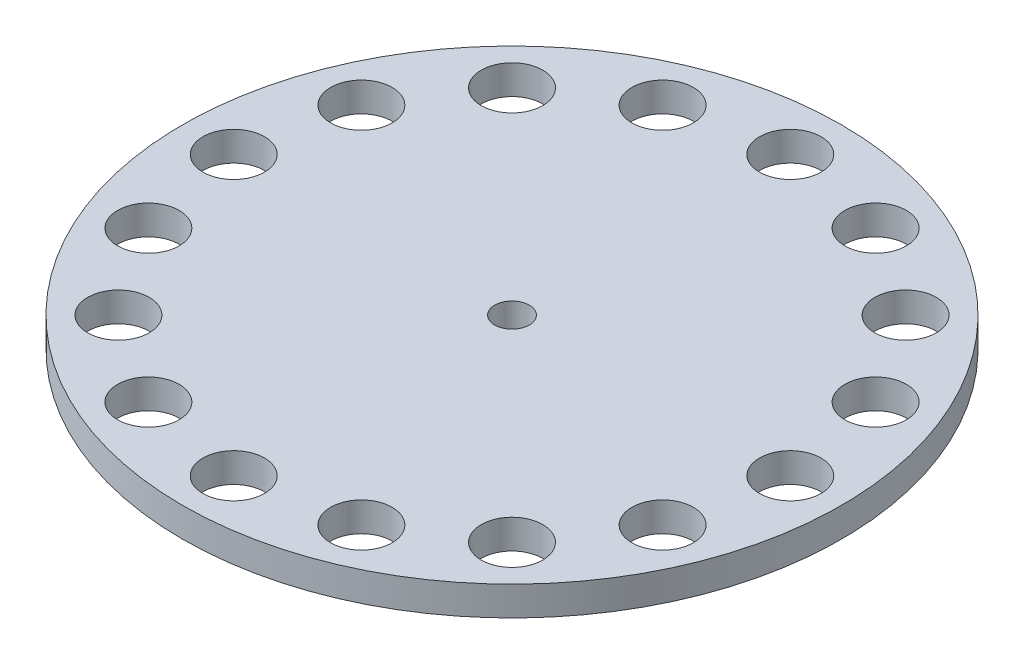
ISO-10303-21;
HEADER;
FILE_DESCRIPTION(('STEP AP214'),'2;1');
FILE_NAME('part.step','',(''),(''),'','','');
FILE_SCHEMA(('AUTOMOTIVE_DESIGN { 1 0 10303 214 1 1 1 1 }'));
ENDSEC;
DATA;
#1=APPLICATION_CONTEXT('core data for automotive mechanical design processes');
#2=APPLICATION_PROTOCOL_DEFINITION('international standard','automotive_design',2000,#1);
#3=PRODUCT_CONTEXT('',#1,'mechanical');
#4=PRODUCT('Part','Part','',(#3));
#5=PRODUCT_RELATED_PRODUCT_CATEGORY('part','',(#4));
#6=PRODUCT_DEFINITION_FORMATION('','',#4);
#7=PRODUCT_DEFINITION_CONTEXT('part definition',#1,'design');
#8=PRODUCT_DEFINITION('design','',#6,#7);
#9=PRODUCT_DEFINITION_SHAPE('','',#8);
#10=(LENGTH_UNIT() NAMED_UNIT(*) SI_UNIT(.MILLI.,.METRE.));
#11=(NAMED_UNIT(*) PLANE_ANGLE_UNIT() SI_UNIT($,.RADIAN.));
#12=(NAMED_UNIT(*) SI_UNIT($,.STERADIAN.) SOLID_ANGLE_UNIT());
#13=UNCERTAINTY_MEASURE_WITH_UNIT(LENGTH_MEASURE(1.E-05),#10,'distance_accuracy_value','');
#14=(GEOMETRIC_REPRESENTATION_CONTEXT(3) GLOBAL_UNCERTAINTY_ASSIGNED_CONTEXT((#13)) GLOBAL_UNIT_ASSIGNED_CONTEXT((#10,
#11,#12)) REPRESENTATION_CONTEXT('',''));
#15=CARTESIAN_POINT('',(0.,0.,0.));
#16=DIRECTION('',(0.,0.,1.));
#17=DIRECTION('',(1.,0.,0.));
#18=AXIS2_PLACEMENT_3D('',#15,#16,#17);
#19=CARTESIAN_POINT('',(0.,5.08,0.));
#20=DIRECTION('',(0.,1.,0.));
#21=DIRECTION('',(0.,0.,1.));
#22=AXIS2_PLACEMENT_3D('',#19,#20,#21);
#23=PLANE('',#22);
#24=CARTESIAN_POINT('',(-34.1249732600628,5.08,-34.1249732600628));
#25=DIRECTION('',(0.,1.,0.));
#26=DIRECTION('',(0.,0.,1.));
#27=AXIS2_PLACEMENT_3D('',#24,#25,#26);
#28=CIRCLE('',#27,5.334);
#29=CARTESIAN_POINT('',(-34.1249732600628,5.08,-28.7909732600628));
#30=VERTEX_POINT('',#29);
#31=EDGE_CURVE('E134',#30,#30,#28,.T.);
#32=ORIENTED_EDGE('',*,*,#31,.F.);
#33=EDGE_LOOP('',(#32));
#34=FACE_BOUND('',#33,.T.);
#35=CARTESIAN_POINT('',(-48.26,5.08,0.));
#36=DIRECTION('',(0.,1.,0.));
#37=DIRECTION('',(0.,0.,1.));
#38=AXIS2_PLACEMENT_3D('',#35,#36,#37);
#39=CIRCLE('',#38,5.33400000000001);
#40=CARTESIAN_POINT('',(-48.26,5.08,5.33400000000001));
#41=VERTEX_POINT('',#40);
#42=EDGE_CURVE('E122',#41,#41,#39,.T.);
#43=ORIENTED_EDGE('',*,*,#42,.F.);
#44=EDGE_LOOP('',(#43));
#45=FACE_BOUND('',#44,.T.);
#46=CARTESIAN_POINT('',(-34.1249732600628,5.08,34.1249732600628));
#47=DIRECTION('',(0.,1.,0.));
#48=DIRECTION('',(0.,0.,1.));
#49=AXIS2_PLACEMENT_3D('',#46,#47,#48);
#50=CIRCLE('',#49,5.334);
#51=CARTESIAN_POINT('',(-34.1249732600628,5.08,39.4589732600628));
#52=VERTEX_POINT('',#51);
#53=EDGE_CURVE('E110',#52,#52,#50,.T.);
#54=ORIENTED_EDGE('',*,*,#53,.F.);
#55=EDGE_LOOP('',(#54));
#56=FACE_BOUND('',#55,.T.);
#57=CARTESIAN_POINT('',(0.,5.08,48.26));
#58=DIRECTION('',(0.,1.,0.));
#59=DIRECTION('',(0.,0.,1.));
#60=AXIS2_PLACEMENT_3D('',#57,#58,#59);
#61=CIRCLE('',#60,5.334);
#62=CARTESIAN_POINT('',(0.,5.08,53.594));
#63=VERTEX_POINT('',#62);
#64=EDGE_CURVE('E98',#63,#63,#61,.T.);
#65=ORIENTED_EDGE('',*,*,#64,.F.);
#66=EDGE_LOOP('',(#65));
#67=FACE_BOUND('',#66,.T.);
#68=CARTESIAN_POINT('',(34.1249732600628,5.08,34.1249732600628));
#69=DIRECTION('',(0.,1.,0.));
#70=DIRECTION('',(0.,0.,1.));
#71=AXIS2_PLACEMENT_3D('',#68,#69,#70);
#72=CIRCLE('',#71,5.334);
#73=CARTESIAN_POINT('',(34.1249732600628,5.08,39.4589732600628));
#74=VERTEX_POINT('',#73);
#75=EDGE_CURVE('E86',#74,#74,#72,.T.);
#76=ORIENTED_EDGE('',*,*,#75,.F.);
#77=EDGE_LOOP('',(#76));
#78=FACE_BOUND('',#77,.T.);
#79=CARTESIAN_POINT('',(48.26,5.08,0.));
#80=DIRECTION('',(0.,1.,0.));
#81=DIRECTION('',(0.,0.,1.));
#82=AXIS2_PLACEMENT_3D('',#79,#80,#81);
#83=CIRCLE('',#82,5.33400000000001);
#84=CARTESIAN_POINT('',(48.26,5.08,5.334));
#85=VERTEX_POINT('',#84);
#86=EDGE_CURVE('E74',#85,#85,#83,.T.);
#87=ORIENTED_EDGE('',*,*,#86,.F.);
#88=EDGE_LOOP('',(#87));
#89=FACE_BOUND('',#88,.T.);
#90=CARTESIAN_POINT('',(34.1249732600628,5.08,-34.1249732600628));
#91=DIRECTION('',(0.,1.,0.));
#92=DIRECTION('',(0.,0.,1.));
#93=AXIS2_PLACEMENT_3D('',#90,#91,#92);
#94=CIRCLE('',#93,5.334);
#95=CARTESIAN_POINT('',(34.1249732600628,5.08,-28.7909732600628));
#96=VERTEX_POINT('',#95);
#97=EDGE_CURVE('E62',#96,#96,#94,.T.);
#98=ORIENTED_EDGE('',*,*,#97,.F.);
#99=EDGE_LOOP('',(#98));
#100=FACE_BOUND('',#99,.T.);
#101=CARTESIAN_POINT('',(0.,5.08,-48.26));
#102=DIRECTION('',(0.,1.,0.));
#103=DIRECTION('',(0.,0.,1.));
#104=AXIS2_PLACEMENT_3D('',#101,#102,#103);
#105=CIRCLE('',#104,5.334);
#106=CARTESIAN_POINT('',(0.,5.08,-42.926));
#107=VERTEX_POINT('',#106);
#108=EDGE_CURVE('E50',#107,#107,#105,.T.);
#109=ORIENTED_EDGE('',*,*,#108,.F.);
#110=EDGE_LOOP('',(#109));
#111=FACE_BOUND('',#110,.T.);
#112=CARTESIAN_POINT('',(0.,5.08,0.));
#113=DIRECTION('',(0.,1.,0.));
#114=DIRECTION('',(0.,0.,1.));
#115=AXIS2_PLACEMENT_3D('',#112,#113,#114);
#116=CIRCLE('',#115,57.15);
#117=CARTESIAN_POINT('',(0.,5.08,57.15));
#118=VERTEX_POINT('',#117);
#119=EDGE_CURVE('E10',#118,#118,#116,.T.);
#120=ORIENTED_EDGE('',*,*,#119,.T.);
#121=EDGE_LOOP('',(#120));
#122=FACE_BOUND('',#121,.T.);
#123=CARTESIAN_POINT('',(0.,5.08,0.));
#124=DIRECTION('',(0.,1.,0.));
#125=DIRECTION('',(0.,0.,1.));
#126=AXIS2_PLACEMENT_3D('',#123,#124,#125);
#127=CIRCLE('',#126,2.9972);
#128=CARTESIAN_POINT('',(0.,5.08,2.9972));
#129=VERTEX_POINT('',#128);
#130=EDGE_CURVE('E45',#129,#129,#127,.T.);
#131=ORIENTED_EDGE('',*,*,#130,.F.);
#132=EDGE_LOOP('',(#131));
#133=FACE_BOUND('',#132,.T.);
#134=CARTESIAN_POINT('',(18.4683024459392,5.08,-44.5864262389947));
#135=DIRECTION('',(0.,1.,0.));
#136=DIRECTION('',(0.,0.,1.));
#137=AXIS2_PLACEMENT_3D('',#134,#135,#136);
#138=CIRCLE('',#137,5.334);
#139=CARTESIAN_POINT('',(18.4683024459392,5.08,-39.2524262389947));
#140=VERTEX_POINT('',#139);
#141=EDGE_CURVE('E56',#140,#140,#138,.T.);
#142=ORIENTED_EDGE('',*,*,#141,.F.);
#143=EDGE_LOOP('',(#142));
#144=FACE_BOUND('',#143,.T.);
#145=CARTESIAN_POINT('',(44.5864262389947,5.08,-18.4683024459392));
#146=DIRECTION('',(0.,1.,0.));
#147=DIRECTION('',(0.,0.,1.));
#148=AXIS2_PLACEMENT_3D('',#145,#146,#147);
#149=CIRCLE('',#148,5.33399999999999);
#150=CARTESIAN_POINT('',(44.5864262389947,5.08,-13.1343024459392));
#151=VERTEX_POINT('',#150);
#152=EDGE_CURVE('E68',#151,#151,#149,.T.);
#153=ORIENTED_EDGE('',*,*,#152,.F.);
#154=EDGE_LOOP('',(#153));
#155=FACE_BOUND('',#154,.T.);
#156=CARTESIAN_POINT('',(44.5864262389947,5.08,18.4683024459392));
#157=DIRECTION('',(0.,1.,0.));
#158=DIRECTION('',(0.,0.,1.));
#159=AXIS2_PLACEMENT_3D('',#156,#157,#158);
#160=CIRCLE('',#159,5.33399999999999);
#161=CARTESIAN_POINT('',(44.5864262389947,5.08,23.8023024459392));
#162=VERTEX_POINT('',#161);
#163=EDGE_CURVE('E80',#162,#162,#160,.T.);
#164=ORIENTED_EDGE('',*,*,#163,.F.);
#165=EDGE_LOOP('',(#164));
#166=FACE_BOUND('',#165,.T.);
#167=CARTESIAN_POINT('',(18.4683024459392,5.08,44.5864262389947));
#168=DIRECTION('',(0.,1.,0.));
#169=DIRECTION('',(0.,0.,1.));
#170=AXIS2_PLACEMENT_3D('',#167,#168,#169);
#171=CIRCLE('',#170,5.334);
#172=CARTESIAN_POINT('',(18.4683024459392,5.08,49.9204262389947));
#173=VERTEX_POINT('',#172);
#174=EDGE_CURVE('E92',#173,#173,#171,.T.);
#175=ORIENTED_EDGE('',*,*,#174,.F.);
#176=EDGE_LOOP('',(#175));
#177=FACE_BOUND('',#176,.T.);
#178=CARTESIAN_POINT('',(-18.4683024459392,5.08,44.5864262389947));
#179=DIRECTION('',(0.,1.,0.));
#180=DIRECTION('',(0.,0.,1.));
#181=AXIS2_PLACEMENT_3D('',#178,#179,#180);
#182=CIRCLE('',#181,5.334);
#183=CARTESIAN_POINT('',(-18.4683024459392,5.08,49.9204262389947));
#184=VERTEX_POINT('',#183);
#185=EDGE_CURVE('E104',#184,#184,#182,.T.);
#186=ORIENTED_EDGE('',*,*,#185,.F.);
#187=EDGE_LOOP('',(#186));
#188=FACE_BOUND('',#187,.T.);
#189=CARTESIAN_POINT('',(-44.5864262389947,5.08,18.4683024459393));
#190=DIRECTION('',(0.,1.,0.));
#191=DIRECTION('',(0.,0.,1.));
#192=AXIS2_PLACEMENT_3D('',#189,#190,#191);
#193=CIRCLE('',#192,5.334);
#194=CARTESIAN_POINT('',(-44.5864262389947,5.08,23.8023024459393));
#195=VERTEX_POINT('',#194);
#196=EDGE_CURVE('E116',#195,#195,#193,.T.);
#197=ORIENTED_EDGE('',*,*,#196,.F.);
#198=EDGE_LOOP('',(#197));
#199=FACE_BOUND('',#198,.T.);
#200=CARTESIAN_POINT('',(-44.5864262389947,5.08,-18.4683024459392));
#201=DIRECTION('',(0.,1.,0.));
#202=DIRECTION('',(0.,0.,1.));
#203=AXIS2_PLACEMENT_3D('',#200,#201,#202);
#204=CIRCLE('',#203,5.334);
#205=CARTESIAN_POINT('',(-44.5864262389947,5.08,-13.1343024459392));
#206=VERTEX_POINT('',#205);
#207=EDGE_CURVE('E128',#206,#206,#204,.T.);
#208=ORIENTED_EDGE('',*,*,#207,.F.);
#209=EDGE_LOOP('',(#208));
#210=FACE_BOUND('',#209,.T.);
#211=CARTESIAN_POINT('',(-18.4683024459393,5.08,-44.5864262389947));
#212=DIRECTION('',(0.,1.,0.));
#213=DIRECTION('',(0.,0.,1.));
#214=AXIS2_PLACEMENT_3D('',#211,#212,#213);
#215=CIRCLE('',#214,5.334);
#216=CARTESIAN_POINT('',(-18.4683024459393,5.08,-39.2524262389947));
#217=VERTEX_POINT('',#216);
#218=EDGE_CURVE('E140',#217,#217,#215,.T.);
#219=ORIENTED_EDGE('',*,*,#218,.F.);
#220=EDGE_LOOP('',(#219));
#221=FACE_BOUND('',#220,.T.);
#222=ADVANCED_FACE('F34',(#34,#45,#56,#67,#78,#89,#100,#111,#122,#133,#144,#155,#166,#177,#188,
#199,#210,#221),#23,.T.);
#223=CARTESIAN_POINT('',(0.,0.,0.));
#224=DIRECTION('',(0.,1.,0.));
#225=DIRECTION('',(0.,0.,1.));
#226=AXIS2_PLACEMENT_3D('',#223,#224,#225);
#227=PLANE('',#226);
#228=CARTESIAN_POINT('',(0.,0.,0.));
#229=DIRECTION('',(0.,1.,0.));
#230=DIRECTION('',(0.,0.,1.));
#231=AXIS2_PLACEMENT_3D('',#228,#229,#230);
#232=CIRCLE('',#231,57.15);
#233=CARTESIAN_POINT('',(0.,0.,57.15));
#234=VERTEX_POINT('',#233);
#235=EDGE_CURVE('E38',#234,#234,#232,.T.);
#236=ORIENTED_EDGE('',*,*,#235,.F.);
#237=EDGE_LOOP('',(#236));
#238=FACE_BOUND('',#237,.T.);
#239=CARTESIAN_POINT('',(0.,0.,0.));
#240=DIRECTION('',(0.,1.,0.));
#241=DIRECTION('',(0.,0.,1.));
#242=AXIS2_PLACEMENT_3D('',#239,#240,#241);
#243=CIRCLE('',#242,2.9972);
#244=CARTESIAN_POINT('',(0.,0.,2.9972));
#245=VERTEX_POINT('',#244);
#246=EDGE_CURVE('E47',#245,#245,#243,.T.);
#247=ORIENTED_EDGE('',*,*,#246,.T.);
#248=EDGE_LOOP('',(#247));
#249=FACE_BOUND('',#248,.T.);
#250=CARTESIAN_POINT('',(0.,0.,-48.26));
#251=DIRECTION('',(0.,1.,0.));
#252=DIRECTION('',(0.,0.,1.));
#253=AXIS2_PLACEMENT_3D('',#250,#251,#252);
#254=CIRCLE('',#253,5.334);
#255=CARTESIAN_POINT('',(0.,0.,-42.926));
#256=VERTEX_POINT('',#255);
#257=EDGE_CURVE('E53',#256,#256,#254,.T.);
#258=ORIENTED_EDGE('',*,*,#257,.T.);
#259=EDGE_LOOP('',(#258));
#260=FACE_BOUND('',#259,.T.);
#261=CARTESIAN_POINT('',(18.4683024459392,0.,-44.5864262389947));
#262=DIRECTION('',(0.,1.,0.));
#263=DIRECTION('',(0.,0.,1.));
#264=AXIS2_PLACEMENT_3D('',#261,#262,#263);
#265=CIRCLE('',#264,5.334);
#266=CARTESIAN_POINT('',(18.4683024459392,0.,-39.2524262389947));
#267=VERTEX_POINT('',#266);
#268=EDGE_CURVE('E59',#267,#267,#265,.T.);
#269=ORIENTED_EDGE('',*,*,#268,.T.);
#270=EDGE_LOOP('',(#269));
#271=FACE_BOUND('',#270,.T.);
#272=CARTESIAN_POINT('',(34.1249732600628,0.,-34.1249732600628));
#273=DIRECTION('',(0.,1.,0.));
#274=DIRECTION('',(0.,0.,1.));
#275=AXIS2_PLACEMENT_3D('',#272,#273,#274);
#276=CIRCLE('',#275,5.334);
#277=CARTESIAN_POINT('',(34.1249732600628,0.,-28.7909732600628));
#278=VERTEX_POINT('',#277);
#279=EDGE_CURVE('E65',#278,#278,#276,.T.);
#280=ORIENTED_EDGE('',*,*,#279,.T.);
#281=EDGE_LOOP('',(#280));
#282=FACE_BOUND('',#281,.T.);
#283=CARTESIAN_POINT('',(44.5864262389947,0.,-18.4683024459392));
#284=DIRECTION('',(0.,1.,0.));
#285=DIRECTION('',(0.,0.,1.));
#286=AXIS2_PLACEMENT_3D('',#283,#284,#285);
#287=CIRCLE('',#286,5.33399999999999);
#288=CARTESIAN_POINT('',(44.5864262389947,0.,-13.1343024459392));
#289=VERTEX_POINT('',#288);
#290=EDGE_CURVE('E71',#289,#289,#287,.T.);
#291=ORIENTED_EDGE('',*,*,#290,.T.);
#292=EDGE_LOOP('',(#291));
#293=FACE_BOUND('',#292,.T.);
#294=CARTESIAN_POINT('',(48.26,0.,0.));
#295=DIRECTION('',(0.,1.,0.));
#296=DIRECTION('',(0.,0.,1.));
#297=AXIS2_PLACEMENT_3D('',#294,#295,#296);
#298=CIRCLE('',#297,5.33400000000001);
#299=CARTESIAN_POINT('',(48.26,0.,5.334));
#300=VERTEX_POINT('',#299);
#301=EDGE_CURVE('E77',#300,#300,#298,.T.);
#302=ORIENTED_EDGE('',*,*,#301,.T.);
#303=EDGE_LOOP('',(#302));
#304=FACE_BOUND('',#303,.T.);
#305=CARTESIAN_POINT('',(44.5864262389947,0.,18.4683024459392));
#306=DIRECTION('',(0.,1.,0.));
#307=DIRECTION('',(0.,0.,1.));
#308=AXIS2_PLACEMENT_3D('',#305,#306,#307);
#309=CIRCLE('',#308,5.33399999999999);
#310=CARTESIAN_POINT('',(44.5864262389947,0.,23.8023024459392));
#311=VERTEX_POINT('',#310);
#312=EDGE_CURVE('E83',#311,#311,#309,.T.);
#313=ORIENTED_EDGE('',*,*,#312,.T.);
#314=EDGE_LOOP('',(#313));
#315=FACE_BOUND('',#314,.T.);
#316=CARTESIAN_POINT('',(34.1249732600628,0.,34.1249732600628));
#317=DIRECTION('',(0.,1.,0.));
#318=DIRECTION('',(0.,0.,1.));
#319=AXIS2_PLACEMENT_3D('',#316,#317,#318);
#320=CIRCLE('',#319,5.334);
#321=CARTESIAN_POINT('',(34.1249732600628,0.,39.4589732600628));
#322=VERTEX_POINT('',#321);
#323=EDGE_CURVE('E89',#322,#322,#320,.T.);
#324=ORIENTED_EDGE('',*,*,#323,.T.);
#325=EDGE_LOOP('',(#324));
#326=FACE_BOUND('',#325,.T.);
#327=CARTESIAN_POINT('',(18.4683024459392,0.,44.5864262389947));
#328=DIRECTION('',(0.,1.,0.));
#329=DIRECTION('',(0.,0.,1.));
#330=AXIS2_PLACEMENT_3D('',#327,#328,#329);
#331=CIRCLE('',#330,5.334);
#332=CARTESIAN_POINT('',(18.4683024459392,0.,49.9204262389947));
#333=VERTEX_POINT('',#332);
#334=EDGE_CURVE('E95',#333,#333,#331,.T.);
#335=ORIENTED_EDGE('',*,*,#334,.T.);
#336=EDGE_LOOP('',(#335));
#337=FACE_BOUND('',#336,.T.);
#338=CARTESIAN_POINT('',(0.,0.,48.26));
#339=DIRECTION('',(0.,1.,0.));
#340=DIRECTION('',(0.,0.,1.));
#341=AXIS2_PLACEMENT_3D('',#338,#339,#340);
#342=CIRCLE('',#341,5.334);
#343=CARTESIAN_POINT('',(0.,0.,53.594));
#344=VERTEX_POINT('',#343);
#345=EDGE_CURVE('E101',#344,#344,#342,.T.);
#346=ORIENTED_EDGE('',*,*,#345,.T.);
#347=EDGE_LOOP('',(#346));
#348=FACE_BOUND('',#347,.T.);
#349=CARTESIAN_POINT('',(-18.4683024459392,0.,44.5864262389947));
#350=DIRECTION('',(0.,1.,0.));
#351=DIRECTION('',(0.,0.,1.));
#352=AXIS2_PLACEMENT_3D('',#349,#350,#351);
#353=CIRCLE('',#352,5.334);
#354=CARTESIAN_POINT('',(-18.4683024459392,0.,49.9204262389947));
#355=VERTEX_POINT('',#354);
#356=EDGE_CURVE('E107',#355,#355,#353,.T.);
#357=ORIENTED_EDGE('',*,*,#356,.T.);
#358=EDGE_LOOP('',(#357));
#359=FACE_BOUND('',#358,.T.);
#360=CARTESIAN_POINT('',(-34.1249732600628,0.,34.1249732600628));
#361=DIRECTION('',(0.,1.,0.));
#362=DIRECTION('',(0.,0.,1.));
#363=AXIS2_PLACEMENT_3D('',#360,#361,#362);
#364=CIRCLE('',#363,5.334);
#365=CARTESIAN_POINT('',(-34.1249732600628,0.,39.4589732600628));
#366=VERTEX_POINT('',#365);
#367=EDGE_CURVE('E113',#366,#366,#364,.T.);
#368=ORIENTED_EDGE('',*,*,#367,.T.);
#369=EDGE_LOOP('',(#368));
#370=FACE_BOUND('',#369,.T.);
#371=CARTESIAN_POINT('',(-44.5864262389947,0.,18.4683024459393));
#372=DIRECTION('',(0.,1.,0.));
#373=DIRECTION('',(0.,0.,1.));
#374=AXIS2_PLACEMENT_3D('',#371,#372,#373);
#375=CIRCLE('',#374,5.334);
#376=CARTESIAN_POINT('',(-44.5864262389947,0.,23.8023024459393));
#377=VERTEX_POINT('',#376);
#378=EDGE_CURVE('E119',#377,#377,#375,.T.);
#379=ORIENTED_EDGE('',*,*,#378,.T.);
#380=EDGE_LOOP('',(#379));
#381=FACE_BOUND('',#380,.T.);
#382=CARTESIAN_POINT('',(-48.26,0.,0.));
#383=DIRECTION('',(0.,1.,0.));
#384=DIRECTION('',(0.,0.,1.));
#385=AXIS2_PLACEMENT_3D('',#382,#383,#384);
#386=CIRCLE('',#385,5.33400000000001);
#387=CARTESIAN_POINT('',(-48.26,0.,5.33400000000001));
#388=VERTEX_POINT('',#387);
#389=EDGE_CURVE('E125',#388,#388,#386,.T.);
#390=ORIENTED_EDGE('',*,*,#389,.T.);
#391=EDGE_LOOP('',(#390));
#392=FACE_BOUND('',#391,.T.);
#393=CARTESIAN_POINT('',(-44.5864262389947,0.,-18.4683024459392));
#394=DIRECTION('',(0.,1.,0.));
#395=DIRECTION('',(0.,0.,1.));
#396=AXIS2_PLACEMENT_3D('',#393,#394,#395);
#397=CIRCLE('',#396,5.334);
#398=CARTESIAN_POINT('',(-44.5864262389947,0.,-13.1343024459392));
#399=VERTEX_POINT('',#398);
#400=EDGE_CURVE('E131',#399,#399,#397,.T.);
#401=ORIENTED_EDGE('',*,*,#400,.T.);
#402=EDGE_LOOP('',(#401));
#403=FACE_BOUND('',#402,.T.);
#404=CARTESIAN_POINT('',(-34.1249732600628,0.,-34.1249732600628));
#405=DIRECTION('',(0.,1.,0.));
#406=DIRECTION('',(0.,0.,1.));
#407=AXIS2_PLACEMENT_3D('',#404,#405,#406);
#408=CIRCLE('',#407,5.334);
#409=CARTESIAN_POINT('',(-34.1249732600628,0.,-28.7909732600628));
#410=VERTEX_POINT('',#409);
#411=EDGE_CURVE('E137',#410,#410,#408,.T.);
#412=ORIENTED_EDGE('',*,*,#411,.T.);
#413=EDGE_LOOP('',(#412));
#414=FACE_BOUND('',#413,.T.);
#415=CARTESIAN_POINT('',(-18.4683024459393,0.,-44.5864262389947));
#416=DIRECTION('',(0.,1.,0.));
#417=DIRECTION('',(0.,0.,1.));
#418=AXIS2_PLACEMENT_3D('',#415,#416,#417);
#419=CIRCLE('',#418,5.334);
#420=CARTESIAN_POINT('',(-18.4683024459393,0.,-39.2524262389947));
#421=VERTEX_POINT('',#420);
#422=EDGE_CURVE('E143',#421,#421,#419,.T.);
#423=ORIENTED_EDGE('',*,*,#422,.T.);
#424=EDGE_LOOP('',(#423));
#425=FACE_BOUND('',#424,.T.);
#426=ADVANCED_FACE('F153',(#238,#249,#260,#271,#282,#293,#304,#315,#326,#337,#348,#359,#370,
#381,#392,#403,#414,#425),#227,.F.);
#427=CARTESIAN_POINT('',(0.,5.08,0.));
#428=DIRECTION('',(0.,-1.,0.));
#429=DIRECTION('',(0.,0.,-1.));
#430=AXIS2_PLACEMENT_3D('',#427,#428,#429);
#431=CYLINDRICAL_SURFACE('',#430,57.15);
#432=ORIENTED_EDGE('',*,*,#119,.F.);
#433=EDGE_LOOP('',(#432));
#434=FACE_BOUND('',#433,.T.);
#435=ORIENTED_EDGE('',*,*,#235,.T.);
#436=EDGE_LOOP('',(#435));
#437=FACE_BOUND('',#436,.T.);
#438=ADVANCED_FACE('F36',(#434,#437),#431,.T.);
#439=CARTESIAN_POINT('',(0.,5.08,0.));
#440=DIRECTION('',(0.,-1.,0.));
#441=DIRECTION('',(0.,0.,-1.));
#442=AXIS2_PLACEMENT_3D('',#439,#440,#441);
#443=CYLINDRICAL_SURFACE('',#442,2.9972);
#444=ORIENTED_EDGE('',*,*,#130,.T.);
#445=EDGE_LOOP('',(#444));
#446=FACE_BOUND('',#445,.T.);
#447=ORIENTED_EDGE('',*,*,#246,.F.);
#448=EDGE_LOOP('',(#447));
#449=FACE_BOUND('',#448,.T.);
#450=ADVANCED_FACE('F163',(#446,#449),#443,.F.);
#451=CARTESIAN_POINT('',(0.,5.08,-48.26));
#452=DIRECTION('',(0.,-1.,0.));
#453=DIRECTION('',(0.,0.,-1.));
#454=AXIS2_PLACEMENT_3D('',#451,#452,#453);
#455=CYLINDRICAL_SURFACE('',#454,5.334);
#456=ORIENTED_EDGE('',*,*,#108,.T.);
#457=EDGE_LOOP('',(#456));
#458=FACE_BOUND('',#457,.T.);
#459=ORIENTED_EDGE('',*,*,#257,.F.);
#460=EDGE_LOOP('',(#459));
#461=FACE_BOUND('',#460,.T.);
#462=ADVANCED_FACE('F166',(#458,#461),#455,.F.);
#463=CARTESIAN_POINT('',(18.4683024459392,5.08,-44.5864262389947));
#464=DIRECTION('',(0.,-1.,0.));
#465=DIRECTION('',(0.,0.,-1.));
#466=AXIS2_PLACEMENT_3D('',#463,#464,#465);
#467=CYLINDRICAL_SURFACE('',#466,5.334);
#468=ORIENTED_EDGE('',*,*,#141,.T.);
#469=EDGE_LOOP('',(#468));
#470=FACE_BOUND('',#469,.T.);
#471=ORIENTED_EDGE('',*,*,#268,.F.);
#472=EDGE_LOOP('',(#471));
#473=FACE_BOUND('',#472,.T.);
#474=ADVANCED_FACE('F170',(#470,#473),#467,.F.);
#475=CARTESIAN_POINT('',(34.1249732600628,5.08,-34.1249732600628));
#476=DIRECTION('',(0.,-1.,0.));
#477=DIRECTION('',(0.,0.,-1.));
#478=AXIS2_PLACEMENT_3D('',#475,#476,#477);
#479=CYLINDRICAL_SURFACE('',#478,5.334);
#480=ORIENTED_EDGE('',*,*,#97,.T.);
#481=EDGE_LOOP('',(#480));
#482=FACE_BOUND('',#481,.T.);
#483=ORIENTED_EDGE('',*,*,#279,.F.);
#484=EDGE_LOOP('',(#483));
#485=FACE_BOUND('',#484,.T.);
#486=ADVANCED_FACE('F174',(#482,#485),#479,.F.);
#487=CARTESIAN_POINT('',(44.5864262389947,5.08,-18.4683024459392));
#488=DIRECTION('',(0.,-1.,0.));
#489=DIRECTION('',(0.,0.,-1.));
#490=AXIS2_PLACEMENT_3D('',#487,#488,#489);
#491=CYLINDRICAL_SURFACE('',#490,5.33399999999999);
#492=ORIENTED_EDGE('',*,*,#152,.T.);
#493=EDGE_LOOP('',(#492));
#494=FACE_BOUND('',#493,.T.);
#495=ORIENTED_EDGE('',*,*,#290,.F.);
#496=EDGE_LOOP('',(#495));
#497=FACE_BOUND('',#496,.T.);
#498=ADVANCED_FACE('F178',(#494,#497),#491,.F.);
#499=CARTESIAN_POINT('',(48.26,5.08,0.));
#500=DIRECTION('',(0.,-1.,0.));
#501=DIRECTION('',(0.,0.,-1.));
#502=AXIS2_PLACEMENT_3D('',#499,#500,#501);
#503=CYLINDRICAL_SURFACE('',#502,5.33400000000001);
#504=ORIENTED_EDGE('',*,*,#86,.T.);
#505=EDGE_LOOP('',(#504));
#506=FACE_BOUND('',#505,.T.);
#507=ORIENTED_EDGE('',*,*,#301,.F.);
#508=EDGE_LOOP('',(#507));
#509=FACE_BOUND('',#508,.T.);
#510=ADVANCED_FACE('F182',(#506,#509),#503,.F.);
#511=CARTESIAN_POINT('',(44.5864262389947,5.08,18.4683024459392));
#512=DIRECTION('',(0.,-1.,0.));
#513=DIRECTION('',(0.,0.,-1.));
#514=AXIS2_PLACEMENT_3D('',#511,#512,#513);
#515=CYLINDRICAL_SURFACE('',#514,5.33399999999999);
#516=ORIENTED_EDGE('',*,*,#163,.T.);
#517=EDGE_LOOP('',(#516));
#518=FACE_BOUND('',#517,.T.);
#519=ORIENTED_EDGE('',*,*,#312,.F.);
#520=EDGE_LOOP('',(#519));
#521=FACE_BOUND('',#520,.T.);
#522=ADVANCED_FACE('F186',(#518,#521),#515,.F.);
#523=CARTESIAN_POINT('',(34.1249732600628,5.08,34.1249732600628));
#524=DIRECTION('',(0.,-1.,0.));
#525=DIRECTION('',(0.,0.,-1.));
#526=AXIS2_PLACEMENT_3D('',#523,#524,#525);
#527=CYLINDRICAL_SURFACE('',#526,5.334);
#528=ORIENTED_EDGE('',*,*,#75,.T.);
#529=EDGE_LOOP('',(#528));
#530=FACE_BOUND('',#529,.T.);
#531=ORIENTED_EDGE('',*,*,#323,.F.);
#532=EDGE_LOOP('',(#531));
#533=FACE_BOUND('',#532,.T.);
#534=ADVANCED_FACE('F190',(#530,#533),#527,.F.);
#535=CARTESIAN_POINT('',(18.4683024459392,5.08,44.5864262389947));
#536=DIRECTION('',(0.,-1.,0.));
#537=DIRECTION('',(0.,0.,-1.));
#538=AXIS2_PLACEMENT_3D('',#535,#536,#537);
#539=CYLINDRICAL_SURFACE('',#538,5.334);
#540=ORIENTED_EDGE('',*,*,#174,.T.);
#541=EDGE_LOOP('',(#540));
#542=FACE_BOUND('',#541,.T.);
#543=ORIENTED_EDGE('',*,*,#334,.F.);
#544=EDGE_LOOP('',(#543));
#545=FACE_BOUND('',#544,.T.);
#546=ADVANCED_FACE('F194',(#542,#545),#539,.F.);
#547=CARTESIAN_POINT('',(0.,5.08,48.26));
#548=DIRECTION('',(0.,-1.,0.));
#549=DIRECTION('',(0.,0.,-1.));
#550=AXIS2_PLACEMENT_3D('',#547,#548,#549);
#551=CYLINDRICAL_SURFACE('',#550,5.334);
#552=ORIENTED_EDGE('',*,*,#64,.T.);
#553=EDGE_LOOP('',(#552));
#554=FACE_BOUND('',#553,.T.);
#555=ORIENTED_EDGE('',*,*,#345,.F.);
#556=EDGE_LOOP('',(#555));
#557=FACE_BOUND('',#556,.T.);
#558=ADVANCED_FACE('F198',(#554,#557),#551,.F.);
#559=CARTESIAN_POINT('',(-18.4683024459392,5.08,44.5864262389947));
#560=DIRECTION('',(0.,-1.,0.));
#561=DIRECTION('',(0.,0.,-1.));
#562=AXIS2_PLACEMENT_3D('',#559,#560,#561);
#563=CYLINDRICAL_SURFACE('',#562,5.334);
#564=ORIENTED_EDGE('',*,*,#185,.T.);
#565=EDGE_LOOP('',(#564));
#566=FACE_BOUND('',#565,.T.);
#567=ORIENTED_EDGE('',*,*,#356,.F.);
#568=EDGE_LOOP('',(#567));
#569=FACE_BOUND('',#568,.T.);
#570=ADVANCED_FACE('F202',(#566,#569),#563,.F.);
#571=CARTESIAN_POINT('',(-34.1249732600628,5.08,34.1249732600628));
#572=DIRECTION('',(0.,-1.,0.));
#573=DIRECTION('',(0.,0.,-1.));
#574=AXIS2_PLACEMENT_3D('',#571,#572,#573);
#575=CYLINDRICAL_SURFACE('',#574,5.334);
#576=ORIENTED_EDGE('',*,*,#53,.T.);
#577=EDGE_LOOP('',(#576));
#578=FACE_BOUND('',#577,.T.);
#579=ORIENTED_EDGE('',*,*,#367,.F.);
#580=EDGE_LOOP('',(#579));
#581=FACE_BOUND('',#580,.T.);
#582=ADVANCED_FACE('F206',(#578,#581),#575,.F.);
#583=CARTESIAN_POINT('',(-44.5864262389947,5.08,18.4683024459393));
#584=DIRECTION('',(0.,-1.,0.));
#585=DIRECTION('',(0.,0.,-1.));
#586=AXIS2_PLACEMENT_3D('',#583,#584,#585);
#587=CYLINDRICAL_SURFACE('',#586,5.334);
#588=ORIENTED_EDGE('',*,*,#196,.T.);
#589=EDGE_LOOP('',(#588));
#590=FACE_BOUND('',#589,.T.);
#591=ORIENTED_EDGE('',*,*,#378,.F.);
#592=EDGE_LOOP('',(#591));
#593=FACE_BOUND('',#592,.T.);
#594=ADVANCED_FACE('F210',(#590,#593),#587,.F.);
#595=CARTESIAN_POINT('',(-48.26,5.08,0.));
#596=DIRECTION('',(0.,-1.,0.));
#597=DIRECTION('',(0.,0.,-1.));
#598=AXIS2_PLACEMENT_3D('',#595,#596,#597);
#599=CYLINDRICAL_SURFACE('',#598,5.33400000000001);
#600=ORIENTED_EDGE('',*,*,#42,.T.);
#601=EDGE_LOOP('',(#600));
#602=FACE_BOUND('',#601,.T.);
#603=ORIENTED_EDGE('',*,*,#389,.F.);
#604=EDGE_LOOP('',(#603));
#605=FACE_BOUND('',#604,.T.);
#606=ADVANCED_FACE('F214',(#602,#605),#599,.F.);
#607=CARTESIAN_POINT('',(-44.5864262389947,5.08,-18.4683024459392));
#608=DIRECTION('',(0.,-1.,0.));
#609=DIRECTION('',(0.,0.,-1.));
#610=AXIS2_PLACEMENT_3D('',#607,#608,#609);
#611=CYLINDRICAL_SURFACE('',#610,5.334);
#612=ORIENTED_EDGE('',*,*,#207,.T.);
#613=EDGE_LOOP('',(#612));
#614=FACE_BOUND('',#613,.T.);
#615=ORIENTED_EDGE('',*,*,#400,.F.);
#616=EDGE_LOOP('',(#615));
#617=FACE_BOUND('',#616,.T.);
#618=ADVANCED_FACE('F218',(#614,#617),#611,.F.);
#619=CARTESIAN_POINT('',(-34.1249732600628,5.08,-34.1249732600628));
#620=DIRECTION('',(0.,-1.,0.));
#621=DIRECTION('',(0.,0.,-1.));
#622=AXIS2_PLACEMENT_3D('',#619,#620,#621);
#623=CYLINDRICAL_SURFACE('',#622,5.334);
#624=ORIENTED_EDGE('',*,*,#31,.T.);
#625=EDGE_LOOP('',(#624));
#626=FACE_BOUND('',#625,.T.);
#627=ORIENTED_EDGE('',*,*,#411,.F.);
#628=EDGE_LOOP('',(#627));
#629=FACE_BOUND('',#628,.T.);
#630=ADVANCED_FACE('F222',(#626,#629),#623,.F.);
#631=CARTESIAN_POINT('',(-18.4683024459393,5.08,-44.5864262389947));
#632=DIRECTION('',(0.,-1.,0.));
#633=DIRECTION('',(0.,0.,-1.));
#634=AXIS2_PLACEMENT_3D('',#631,#632,#633);
#635=CYLINDRICAL_SURFACE('',#634,5.334);
#636=ORIENTED_EDGE('',*,*,#218,.T.);
#637=EDGE_LOOP('',(#636));
#638=FACE_BOUND('',#637,.T.);
#639=ORIENTED_EDGE('',*,*,#422,.F.);
#640=EDGE_LOOP('',(#639));
#641=FACE_BOUND('',#640,.T.);
#642=ADVANCED_FACE('F149',(#638,#641),#635,.F.);
#643=CLOSED_SHELL('',(#222,#426,#438,#450,#462,#474,#486,#498,#510,#522,#534,#546,#558,#570,
#582,#594,#606,#618,#630,#642));
#644=MANIFOLD_SOLID_BREP('B2',#643);
#645=ADVANCED_BREP_SHAPE_REPRESENTATION('',(#18,#644),#14);
#646=SHAPE_DEFINITION_REPRESENTATION(#9,#645);
ENDSEC;
END-ISO-10303-21;
